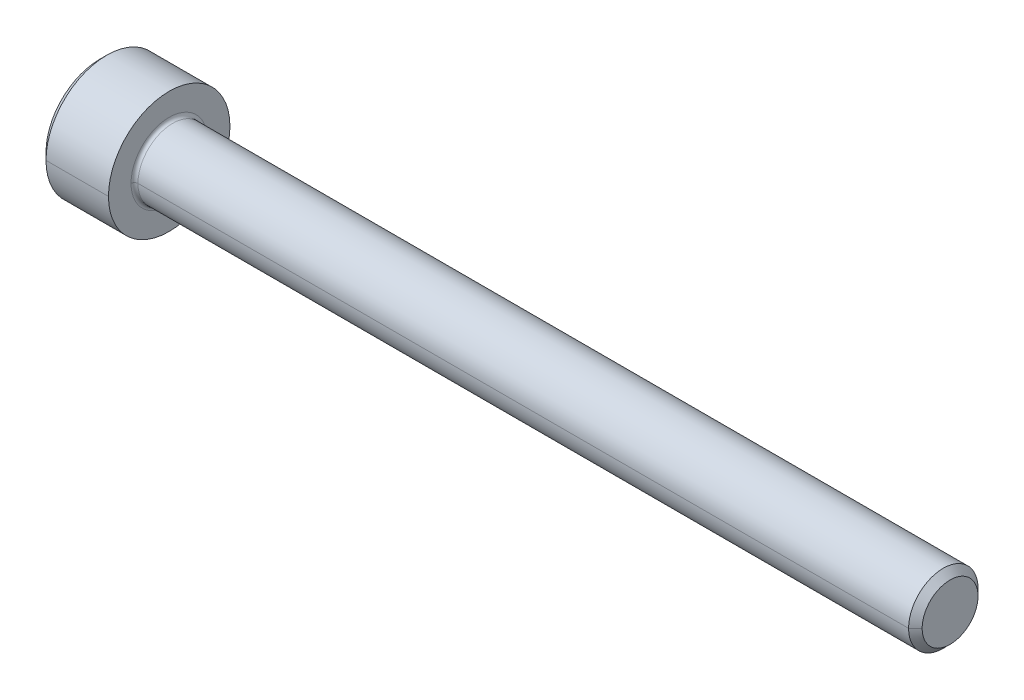
ISO-10303-21;
HEADER;
FILE_DESCRIPTION(('STEP AP214'),'2;1');
FILE_NAME('part.step','',(''),(''),'','','');
FILE_SCHEMA(('AUTOMOTIVE_DESIGN { 1 0 10303 214 1 1 1 1 }'));
ENDSEC;
DATA;
#1=APPLICATION_CONTEXT('core data for automotive mechanical design processes');
#2=APPLICATION_PROTOCOL_DEFINITION('international standard','automotive_design',2000,#1);
#3=PRODUCT_CONTEXT('',#1,'mechanical');
#4=PRODUCT('Part','Part','',(#3));
#5=PRODUCT_RELATED_PRODUCT_CATEGORY('part','',(#4));
#6=PRODUCT_DEFINITION_FORMATION('','',#4);
#7=PRODUCT_DEFINITION_CONTEXT('part definition',#1,'design');
#8=PRODUCT_DEFINITION('design','',#6,#7);
#9=PRODUCT_DEFINITION_SHAPE('','',#8);
#10=(LENGTH_UNIT() NAMED_UNIT(*) SI_UNIT(.MILLI.,.METRE.));
#11=(NAMED_UNIT(*) PLANE_ANGLE_UNIT() SI_UNIT($,.RADIAN.));
#12=(NAMED_UNIT(*) SI_UNIT($,.STERADIAN.) SOLID_ANGLE_UNIT());
#13=UNCERTAINTY_MEASURE_WITH_UNIT(LENGTH_MEASURE(1.E-05),#10,'distance_accuracy_value','');
#14=(GEOMETRIC_REPRESENTATION_CONTEXT(3) GLOBAL_UNCERTAINTY_ASSIGNED_CONTEXT((#13)) GLOBAL_UNIT_ASSIGNED_CONTEXT((#10,
#11,#12)) REPRESENTATION_CONTEXT('',''));
#15=CARTESIAN_POINT('',(0.,0.,0.));
#16=DIRECTION('',(0.,0.,1.));
#17=DIRECTION('',(1.,0.,0.));
#18=AXIS2_PLACEMENT_3D('',#15,#16,#17);
#19=CARTESIAN_POINT('',(2.,0.,0.));
#20=DIRECTION('',(-1.,0.,0.));
#21=DIRECTION('',(0.,0.,1.));
#22=AXIS2_PLACEMENT_3D('',#19,#20,#21);
#23=CONICAL_SURFACE('',#22,1.5355,1.0471975511966);
#24=DIRECTION('',(-0.500000000000008,0.,0.866025403784434));
#25=VECTOR('',#24,1.);
#26=CARTESIAN_POINT('',(2.,0.,1.5355));
#27=LINE('',#26,#25);
#28=CARTESIAN_POINT('',(2.88652133834069,0.,0.));
#29=VERTEX_POINT('',#28);
#30=CARTESIAN_POINT('',(2.,0.,1.5355));
#31=VERTEX_POINT('',#30);
#32=EDGE_CURVE('E42',#29,#31,#27,.T.);
#33=ORIENTED_EDGE('',*,*,#32,.F.);
#34=DIRECTION('',(-0.500000000000008,0.,-0.866025403784434));
#35=VECTOR('',#34,1.);
#36=CARTESIAN_POINT('',(2.,0.,-1.5355));
#37=LINE('',#36,#35);
#38=CARTESIAN_POINT('',(2.00000000000005,0.,-1.5355));
#39=VERTEX_POINT('',#38);
#40=EDGE_CURVE('E11',#29,#39,#37,.T.);
#41=ORIENTED_EDGE('',*,*,#40,.T.);
#42=CARTESIAN_POINT('',(2.,0.,0.));
#43=DIRECTION('',(-1.,0.,0.));
#44=DIRECTION('',(0.,0.,1.));
#45=AXIS2_PLACEMENT_3D('',#42,#43,#44);
#46=CIRCLE('',#45,1.5355);
#47=CARTESIAN_POINT('',(2.,-1.329782007511,-0.767749999999987));
#48=VERTEX_POINT('',#47);
#49=EDGE_CURVE('E28',#39,#48,#46,.T.);
#50=ORIENTED_EDGE('',*,*,#49,.T.);
#51=CARTESIAN_POINT('',(2.,0.,0.));
#52=DIRECTION('',(-1.,0.,0.));
#53=DIRECTION('',(0.,0.,1.));
#54=AXIS2_PLACEMENT_3D('',#51,#52,#53);
#55=CIRCLE('',#54,1.5355);
#56=CARTESIAN_POINT('',(2.,-1.32978200751099,0.76775));
#57=VERTEX_POINT('',#56);
#58=EDGE_CURVE('E172',#48,#57,#55,.T.);
#59=ORIENTED_EDGE('',*,*,#58,.T.);
#60=CARTESIAN_POINT('',(2.,0.,0.));
#61=DIRECTION('',(-1.,0.,0.));
#62=DIRECTION('',(0.,0.,1.));
#63=AXIS2_PLACEMENT_3D('',#60,#61,#62);
#64=CIRCLE('',#63,1.5355);
#65=EDGE_CURVE('E176',#57,#31,#64,.T.);
#66=ORIENTED_EDGE('',*,*,#65,.T.);
#67=EDGE_LOOP('',(#33,#41,#50,#59,#66));
#68=FACE_BOUND('',#67,.T.);
#69=ADVANCED_FACE('F17',(#68),#23,.F.);
#70=CARTESIAN_POINT('',(4.2,0.,0.));
#71=DIRECTION('',(1.,0.,0.));
#72=DIRECTION('',(0.,0.,-1.));
#73=AXIS2_PLACEMENT_3D('',#70,#71,#72);
#74=TOROIDAL_SURFACE('',#73,2.2,0.2);
#75=CARTESIAN_POINT('',(4.2,0.,0.));
#76=DIRECTION('',(1.,0.,0.));
#77=DIRECTION('',(0.,0.,-1.));
#78=AXIS2_PLACEMENT_3D('',#75,#76,#77);
#79=CIRCLE('',#78,2.);
#80=CARTESIAN_POINT('',(4.2,0.,2.));
#81=VERTEX_POINT('',#80);
#82=CARTESIAN_POINT('',(4.2,0.,-2.));
#83=VERTEX_POINT('',#82);
#84=EDGE_CURVE('E185',#81,#83,#79,.T.);
#85=ORIENTED_EDGE('',*,*,#84,.F.);
#86=CARTESIAN_POINT('',(4.2,0.,2.2));
#87=DIRECTION('',(0.,1.,0.));
#88=DIRECTION('',(0.,0.,1.));
#89=AXIS2_PLACEMENT_3D('',#86,#87,#88);
#90=CIRCLE('',#89,0.2);
#91=CARTESIAN_POINT('',(4.,0.,2.2));
#92=VERTEX_POINT('',#91);
#93=EDGE_CURVE('E193',#81,#92,#90,.T.);
#94=ORIENTED_EDGE('',*,*,#93,.T.);
#95=CARTESIAN_POINT('',(4.,0.,0.));
#96=DIRECTION('',(-1.,0.,0.));
#97=DIRECTION('',(0.,0.,-1.));
#98=AXIS2_PLACEMENT_3D('',#95,#96,#97);
#99=CIRCLE('',#98,2.2);
#100=CARTESIAN_POINT('',(4.,0.,-2.2));
#101=VERTEX_POINT('',#100);
#102=EDGE_CURVE('E182',#101,#92,#99,.T.);
#103=ORIENTED_EDGE('',*,*,#102,.F.);
#104=CARTESIAN_POINT('',(4.2,0.,-2.2));
#105=DIRECTION('',(0.,-1.,0.));
#106=DIRECTION('',(0.,0.,-1.));
#107=AXIS2_PLACEMENT_3D('',#104,#105,#106);
#108=CIRCLE('',#107,0.2);
#109=EDGE_CURVE('E188',#83,#101,#108,.T.);
#110=ORIENTED_EDGE('',*,*,#109,.F.);
#111=EDGE_LOOP('',(#85,#94,#103,#110));
#112=FACE_BOUND('',#111,.T.);
#113=ADVANCED_FACE('F396',(#112),#74,.F.);
#114=CARTESIAN_POINT('',(0.,0.,0.));
#115=DIRECTION('',(1.,0.,0.));
#116=DIRECTION('',(0.,0.,-1.));
#117=AXIS2_PLACEMENT_3D('',#114,#115,#116);
#118=CONICAL_SURFACE('',#117,3.1,0.78539816339745);
#119=CARTESIAN_POINT('',(0.,0.,0.));
#120=DIRECTION('',(-1.,0.,0.));
#121=DIRECTION('',(0.,0.,1.));
#122=AXIS2_PLACEMENT_3D('',#119,#120,#121);
#123=CIRCLE('',#122,3.1);
#124=CARTESIAN_POINT('',(0.,0.,3.1));
#125=VERTEX_POINT('',#124);
#126=CARTESIAN_POINT('',(0.,0.,-3.1));
#127=VERTEX_POINT('',#126);
#128=EDGE_CURVE('E21',#125,#127,#123,.T.);
#129=ORIENTED_EDGE('',*,*,#128,.F.);
#130=DIRECTION('',(0.707106781186549,0.,0.707106781186546));
#131=VECTOR('',#130,1.);
#132=CARTESIAN_POINT('',(0.,0.,3.1));
#133=LINE('',#132,#131);
#134=CARTESIAN_POINT('',(0.400000000000012,0.,3.5));
#135=VERTEX_POINT('',#134);
#136=EDGE_CURVE('E196',#125,#135,#133,.T.);
#137=ORIENTED_EDGE('',*,*,#136,.T.);
#138=CARTESIAN_POINT('',(0.400000000000012,0.,0.));
#139=DIRECTION('',(-1.,0.,0.));
#140=DIRECTION('',(0.,0.,1.));
#141=AXIS2_PLACEMENT_3D('',#138,#139,#140);
#142=CIRCLE('',#141,3.5);
#143=CARTESIAN_POINT('',(0.400000000000012,0.,-3.5));
#144=VERTEX_POINT('',#143);
#145=EDGE_CURVE('E205',#135,#144,#142,.T.);
#146=ORIENTED_EDGE('',*,*,#145,.T.);
#147=DIRECTION('',(0.707106781186549,0.,-0.707106781186546));
#148=VECTOR('',#147,1.);
#149=CARTESIAN_POINT('',(0.,0.,-3.1));
#150=LINE('',#149,#148);
#151=EDGE_CURVE('E251',#127,#144,#150,.T.);
#152=ORIENTED_EDGE('',*,*,#151,.F.);
#153=EDGE_LOOP('',(#129,#137,#146,#152));
#154=FACE_BOUND('',#153,.T.);
#155=ADVANCED_FACE('F435',(#154),#118,.T.);
#156=CARTESIAN_POINT('',(-31.75,0.,0.));
#157=DIRECTION('',(-1.,0.,0.));
#158=DIRECTION('',(0.,0.,1.));
#159=AXIS2_PLACEMENT_3D('',#156,#157,#158);
#160=CYLINDRICAL_SURFACE('',#159,3.5);
#161=CARTESIAN_POINT('',(4.,0.,0.));
#162=DIRECTION('',(-1.,0.,0.));
#163=DIRECTION('',(0.,0.,1.));
#164=AXIS2_PLACEMENT_3D('',#161,#162,#163);
#165=CIRCLE('',#164,3.5);
#166=CARTESIAN_POINT('',(4.,0.,3.49999999999996));
#167=VERTEX_POINT('',#166);
#168=CARTESIAN_POINT('',(4.,0.,-3.5));
#169=VERTEX_POINT('',#168);
#170=EDGE_CURVE('E210',#167,#169,#165,.T.);
#171=ORIENTED_EDGE('',*,*,#170,.T.);
#172=DIRECTION('',(-1.,0.,0.));
#173=VECTOR('',#172,1.);
#174=CARTESIAN_POINT('',(-31.75,0.,-3.5));
#175=LINE('',#174,#173);
#176=EDGE_CURVE('E206',#169,#144,#175,.T.);
#177=ORIENTED_EDGE('',*,*,#176,.T.);
#178=ORIENTED_EDGE('',*,*,#145,.F.);
#179=DIRECTION('',(-1.,0.,0.));
#180=VECTOR('',#179,1.);
#181=CARTESIAN_POINT('',(-31.75,0.,3.5));
#182=LINE('',#181,#180);
#183=EDGE_CURVE('E223',#167,#135,#182,.T.);
#184=ORIENTED_EDGE('',*,*,#183,.F.);
#185=EDGE_LOOP('',(#171,#177,#178,#184));
#186=FACE_BOUND('',#185,.T.);
#187=ADVANCED_FACE('F474',(#186),#160,.T.);
#188=CARTESIAN_POINT('',(-31.75,0.,0.));
#189=DIRECTION('',(-1.,0.,0.));
#190=DIRECTION('',(0.,0.,1.));
#191=AXIS2_PLACEMENT_3D('',#188,#189,#190);
#192=CYLINDRICAL_SURFACE('',#191,2.);
#193=CARTESIAN_POINT('',(48.61,0.,0.));
#194=DIRECTION('',(-1.,0.,0.));
#195=DIRECTION('',(0.,0.,1.));
#196=AXIS2_PLACEMENT_3D('',#193,#194,#195);
#197=CIRCLE('',#196,2.);
#198=CARTESIAN_POINT('',(48.61,0.,2.));
#199=VERTEX_POINT('',#198);
#200=CARTESIAN_POINT('',(48.61,0.,-2.));
#201=VERTEX_POINT('',#200);
#202=EDGE_CURVE('E211',#199,#201,#197,.T.);
#203=ORIENTED_EDGE('',*,*,#202,.T.);
#204=DIRECTION('',(-1.,0.,0.));
#205=VECTOR('',#204,1.);
#206=CARTESIAN_POINT('',(-31.75,0.,-2.));
#207=LINE('',#206,#205);
#208=EDGE_CURVE('E234',#201,#83,#207,.T.);
#209=ORIENTED_EDGE('',*,*,#208,.T.);
#210=CARTESIAN_POINT('',(4.2,0.,0.));
#211=DIRECTION('',(1.,0.,0.));
#212=DIRECTION('',(0.,0.,-1.));
#213=AXIS2_PLACEMENT_3D('',#210,#211,#212);
#214=CIRCLE('',#213,2.);
#215=EDGE_CURVE('E230',#83,#81,#214,.T.);
#216=ORIENTED_EDGE('',*,*,#215,.T.);
#217=DIRECTION('',(-1.,0.,0.));
#218=VECTOR('',#217,1.);
#219=CARTESIAN_POINT('',(-31.75,0.,2.));
#220=LINE('',#219,#218);
#221=EDGE_CURVE('E200',#199,#81,#220,.T.);
#222=ORIENTED_EDGE('',*,*,#221,.F.);
#223=EDGE_LOOP('',(#203,#209,#216,#222));
#224=FACE_BOUND('',#223,.T.);
#225=ADVANCED_FACE('F404',(#224),#192,.T.);
#226=CARTESIAN_POINT('',(49.,0.,0.));
#227=DIRECTION('',(-1.,0.,0.));
#228=DIRECTION('',(0.,0.,1.));
#229=AXIS2_PLACEMENT_3D('',#226,#227,#228);
#230=CONICAL_SURFACE('',#229,1.61,0.785398163397463);
#231=CARTESIAN_POINT('',(49.,0.,0.));
#232=DIRECTION('',(-1.,0.,0.));
#233=DIRECTION('',(0.,0.,1.));
#234=AXIS2_PLACEMENT_3D('',#231,#232,#233);
#235=CIRCLE('',#234,1.61);
#236=CARTESIAN_POINT('',(49.,0.,1.61));
#237=VERTEX_POINT('',#236);
#238=CARTESIAN_POINT('',(49.,0.,-1.61));
#239=VERTEX_POINT('',#238);
#240=EDGE_CURVE('E235',#237,#239,#235,.T.);
#241=ORIENTED_EDGE('',*,*,#240,.T.);
#242=DIRECTION('',(-0.70710678118654,0.,-0.707106781186555));
#243=VECTOR('',#242,1.);
#244=CARTESIAN_POINT('',(49.,0.,-1.61));
#245=LINE('',#244,#243);
#246=EDGE_CURVE('E272',#239,#201,#245,.T.);
#247=ORIENTED_EDGE('',*,*,#246,.T.);
#248=ORIENTED_EDGE('',*,*,#202,.F.);
#249=DIRECTION('',(-0.70710678118654,0.,0.707106781186555));
#250=VECTOR('',#249,1.);
#251=CARTESIAN_POINT('',(49.,0.,1.61));
#252=LINE('',#251,#250);
#253=EDGE_CURVE('E177',#237,#199,#252,.T.);
#254=ORIENTED_EDGE('',*,*,#253,.F.);
#255=EDGE_LOOP('',(#241,#247,#248,#254));
#256=FACE_BOUND('',#255,.T.);
#257=ADVANCED_FACE('F488',(#256),#230,.T.);
#258=CARTESIAN_POINT('',(0.,0.,0.));
#259=DIRECTION('',(-1.,0.,0.));
#260=DIRECTION('',(0.,1.,0.));
#261=AXIS2_PLACEMENT_3D('',#258,#259,#260);
#262=PLANE('',#261);
#263=CARTESIAN_POINT('',(0.,0.,0.));
#264=DIRECTION('',(-1.,0.,0.));
#265=DIRECTION('',(0.,0.,1.));
#266=AXIS2_PLACEMENT_3D('',#263,#264,#265);
#267=CIRCLE('',#266,3.1);
#268=EDGE_CURVE('E276',#127,#125,#267,.T.);
#269=ORIENTED_EDGE('',*,*,#268,.T.);
#270=ORIENTED_EDGE('',*,*,#128,.T.);
#271=EDGE_LOOP('',(#269,#270));
#272=FACE_BOUND('',#271,.T.);
#273=DIRECTION('',(0.,-0.5,0.866025403784439));
#274=VECTOR('',#273,1.);
#275=CARTESIAN_POINT('',(0.,1.77304267668132,0.));
#276=LINE('',#275,#274);
#277=CARTESIAN_POINT('',(0.,1.77304267668132,0.));
#278=VERTEX_POINT('',#277);
#279=CARTESIAN_POINT('',(0.,0.886521338340666,1.5355));
#280=VERTEX_POINT('',#279);
#281=EDGE_CURVE('E117',#278,#280,#276,.T.);
#282=ORIENTED_EDGE('',*,*,#281,.T.);
#283=DIRECTION('',(0.,1.,0.));
#284=VECTOR('',#283,1.);
#285=CARTESIAN_POINT('',(0.,-0.886521338340659,1.5355));
#286=LINE('',#285,#284);
#287=CARTESIAN_POINT('',(0.,-0.886521338340659,1.5355));
#288=VERTEX_POINT('',#287);
#289=EDGE_CURVE('E109',#288,#280,#286,.T.);
#290=ORIENTED_EDGE('',*,*,#289,.F.);
#291=DIRECTION('',(0.,-0.5,-0.866025403784438));
#292=VECTOR('',#291,1.);
#293=CARTESIAN_POINT('',(0.,-0.886521338340659,1.5355));
#294=LINE('',#293,#292);
#295=CARTESIAN_POINT('',(0.,-1.77304267668132,0.));
#296=VERTEX_POINT('',#295);
#297=EDGE_CURVE('E113',#288,#296,#294,.T.);
#298=ORIENTED_EDGE('',*,*,#297,.T.);
#299=DIRECTION('',(0.,0.5,-0.866025403784439));
#300=VECTOR('',#299,1.);
#301=CARTESIAN_POINT('',(0.,-1.77304267668132,0.));
#302=LINE('',#301,#300);
#303=CARTESIAN_POINT('',(0.,-0.886521338340668,-1.5355));
#304=VERTEX_POINT('',#303);
#305=EDGE_CURVE('E134',#296,#304,#302,.T.);
#306=ORIENTED_EDGE('',*,*,#305,.T.);
#307=DIRECTION('',(0.,-1.,0.));
#308=VECTOR('',#307,1.);
#309=CARTESIAN_POINT('',(0.,0.886521338340659,-1.5355));
#310=LINE('',#309,#308);
#311=CARTESIAN_POINT('',(0.,0.886521338340659,-1.5355));
#312=VERTEX_POINT('',#311);
#313=EDGE_CURVE('E228',#312,#304,#310,.T.);
#314=ORIENTED_EDGE('',*,*,#313,.F.);
#315=DIRECTION('',(0.,-0.5,-0.866025403784438));
#316=VECTOR('',#315,1.);
#317=CARTESIAN_POINT('',(0.,1.77304267668132,0.));
#318=LINE('',#317,#316);
#319=EDGE_CURVE('E229',#278,#312,#318,.T.);
#320=ORIENTED_EDGE('',*,*,#319,.F.);
#321=EDGE_LOOP('',(#282,#290,#298,#306,#314,#320));
#322=FACE_BOUND('',#321,.T.);
#323=ADVANCED_FACE('F111',(#272,#322),#262,.T.);
#324=CARTESIAN_POINT('',(49.,1.61,0.));
#325=DIRECTION('',(1.,0.,0.));
#326=DIRECTION('',(0.,0.,1.));
#327=AXIS2_PLACEMENT_3D('',#324,#325,#326);
#328=PLANE('',#327);
#329=ORIENTED_EDGE('',*,*,#240,.F.);
#330=CARTESIAN_POINT('',(49.,0.,0.));
#331=DIRECTION('',(-1.,0.,0.));
#332=DIRECTION('',(0.,0.,1.));
#333=AXIS2_PLACEMENT_3D('',#330,#331,#332);
#334=CIRCLE('',#333,1.61);
#335=EDGE_CURVE('E164',#239,#237,#334,.T.);
#336=ORIENTED_EDGE('',*,*,#335,.F.);
#337=EDGE_LOOP('',(#329,#336));
#338=FACE_BOUND('',#337,.T.);
#339=ADVANCED_FACE('F443',(#338),#328,.T.);
#340=CARTESIAN_POINT('',(49.,0.,0.));
#341=DIRECTION('',(-1.,0.,0.));
#342=DIRECTION('',(0.,0.,1.));
#343=AXIS2_PLACEMENT_3D('',#340,#341,#342);
#344=CONICAL_SURFACE('',#343,1.61,0.785398163397463);
#345=ORIENTED_EDGE('',*,*,#246,.F.);
#346=ORIENTED_EDGE('',*,*,#335,.T.);
#347=ORIENTED_EDGE('',*,*,#253,.T.);
#348=CARTESIAN_POINT('',(48.61,0.,0.));
#349=DIRECTION('',(-1.,0.,0.));
#350=DIRECTION('',(0.,0.,1.));
#351=AXIS2_PLACEMENT_3D('',#348,#349,#350);
#352=CIRCLE('',#351,2.);
#353=EDGE_CURVE('E181',#201,#199,#352,.T.);
#354=ORIENTED_EDGE('',*,*,#353,.F.);
#355=EDGE_LOOP('',(#345,#346,#347,#354));
#356=FACE_BOUND('',#355,.T.);
#357=ADVANCED_FACE('F424',(#356),#344,.T.);
#358=CARTESIAN_POINT('',(-31.75,0.,0.));
#359=DIRECTION('',(-1.,0.,0.));
#360=DIRECTION('',(0.,0.,1.));
#361=AXIS2_PLACEMENT_3D('',#358,#359,#360);
#362=CYLINDRICAL_SURFACE('',#361,2.);
#363=ORIENTED_EDGE('',*,*,#208,.F.);
#364=ORIENTED_EDGE('',*,*,#353,.T.);
#365=ORIENTED_EDGE('',*,*,#221,.T.);
#366=ORIENTED_EDGE('',*,*,#84,.T.);
#367=EDGE_LOOP('',(#363,#364,#365,#366));
#368=FACE_BOUND('',#367,.T.);
#369=ADVANCED_FACE('F402',(#368),#362,.T.);
#370=CARTESIAN_POINT('',(4.,3.5,0.));
#371=DIRECTION('',(1.,0.,0.));
#372=DIRECTION('',(0.,0.,1.));
#373=AXIS2_PLACEMENT_3D('',#370,#371,#372);
#374=PLANE('',#373);
#375=ORIENTED_EDGE('',*,*,#170,.F.);
#376=CARTESIAN_POINT('',(4.,0.,0.));
#377=DIRECTION('',(-1.,0.,0.));
#378=DIRECTION('',(0.,0.,1.));
#379=AXIS2_PLACEMENT_3D('',#376,#377,#378);
#380=CIRCLE('',#379,3.5);
#381=EDGE_CURVE('E219',#169,#167,#380,.T.);
#382=ORIENTED_EDGE('',*,*,#381,.F.);
#383=EDGE_LOOP('',(#375,#382));
#384=FACE_BOUND('',#383,.T.);
#385=ORIENTED_EDGE('',*,*,#102,.T.);
#386=CARTESIAN_POINT('',(4.,0.,0.));
#387=DIRECTION('',(-1.,0.,0.));
#388=DIRECTION('',(0.,0.,-1.));
#389=AXIS2_PLACEMENT_3D('',#386,#387,#388);
#390=CIRCLE('',#389,2.2);
#391=EDGE_CURVE('E186',#92,#101,#390,.T.);
#392=ORIENTED_EDGE('',*,*,#391,.T.);
#393=EDGE_LOOP('',(#385,#392));
#394=FACE_BOUND('',#393,.T.);
#395=ADVANCED_FACE('F410',(#384,#394),#374,.T.);
#396=CARTESIAN_POINT('',(-31.75,0.,0.));
#397=DIRECTION('',(-1.,0.,0.));
#398=DIRECTION('',(0.,0.,1.));
#399=AXIS2_PLACEMENT_3D('',#396,#397,#398);
#400=CYLINDRICAL_SURFACE('',#399,3.5);
#401=ORIENTED_EDGE('',*,*,#176,.F.);
#402=ORIENTED_EDGE('',*,*,#381,.T.);
#403=ORIENTED_EDGE('',*,*,#183,.T.);
#404=CARTESIAN_POINT('',(0.400000000000012,0.,0.));
#405=DIRECTION('',(-1.,0.,0.));
#406=DIRECTION('',(0.,0.,1.));
#407=AXIS2_PLACEMENT_3D('',#404,#405,#406);
#408=CIRCLE('',#407,3.5);
#409=EDGE_CURVE('E191',#144,#135,#408,.T.);
#410=ORIENTED_EDGE('',*,*,#409,.F.);
#411=EDGE_LOOP('',(#401,#402,#403,#410));
#412=FACE_BOUND('',#411,.T.);
#413=ADVANCED_FACE('F412',(#412),#400,.T.);
#414=CARTESIAN_POINT('',(0.,0.,0.));
#415=DIRECTION('',(1.,0.,0.));
#416=DIRECTION('',(0.,0.,-1.));
#417=AXIS2_PLACEMENT_3D('',#414,#415,#416);
#418=CONICAL_SURFACE('',#417,3.1,0.78539816339745);
#419=ORIENTED_EDGE('',*,*,#136,.F.);
#420=ORIENTED_EDGE('',*,*,#268,.F.);
#421=ORIENTED_EDGE('',*,*,#151,.T.);
#422=ORIENTED_EDGE('',*,*,#409,.T.);
#423=EDGE_LOOP('',(#419,#420,#421,#422));
#424=FACE_BOUND('',#423,.T.);
#425=ADVANCED_FACE('F421',(#424),#418,.T.);
#426=CARTESIAN_POINT('',(4.2,0.,0.));
#427=DIRECTION('',(1.,0.,0.));
#428=DIRECTION('',(0.,0.,-1.));
#429=AXIS2_PLACEMENT_3D('',#426,#427,#428);
#430=TOROIDAL_SURFACE('',#429,2.2,0.2);
#431=ORIENTED_EDGE('',*,*,#93,.F.);
#432=ORIENTED_EDGE('',*,*,#215,.F.);
#433=ORIENTED_EDGE('',*,*,#109,.T.);
#434=ORIENTED_EDGE('',*,*,#391,.F.);
#435=EDGE_LOOP('',(#431,#432,#433,#434));
#436=FACE_BOUND('',#435,.T.);
#437=ADVANCED_FACE('F408',(#436),#430,.F.);
#438=CARTESIAN_POINT('',(2.00000000000005,1.77304267668132,0.));
#439=DIRECTION('',(0.,-0.866025403784439,-0.5));
#440=DIRECTION('',(0.,0.5,-0.866025403784439));
#441=AXIS2_PLACEMENT_3D('',#438,#439,#440);
#442=PLANE('',#441);
#443=ORIENTED_EDGE('',*,*,#281,.F.);
#444=DIRECTION('',(-1.,0.,0.));
#445=VECTOR('',#444,1.);
#446=CARTESIAN_POINT('',(2.00000000000005,1.77304267668132,0.));
#447=LINE('',#446,#445);
#448=CARTESIAN_POINT('',(2.00000000000005,1.77304267668132,0.));
#449=VERTEX_POINT('',#448);
#450=EDGE_CURVE('E247',#449,#278,#447,.T.);
#451=ORIENTED_EDGE('',*,*,#450,.F.);
#452=DIRECTION('',(0.,-0.5,0.866025403784439));
#453=VECTOR('',#452,1.);
#454=CARTESIAN_POINT('',(2.00000000000005,1.77304267668132,0.));
#455=LINE('',#454,#453);
#456=CARTESIAN_POINT('',(2.,1.329782007511,0.767749999999991));
#457=VERTEX_POINT('',#456);
#458=EDGE_CURVE('E161',#449,#457,#455,.T.);
#459=ORIENTED_EDGE('',*,*,#458,.T.);
#460=DIRECTION('',(0.,-0.5,0.866025403784439));
#461=VECTOR('',#460,1.);
#462=CARTESIAN_POINT('',(2.00000000000005,1.77304267668132,0.));
#463=LINE('',#462,#461);
#464=CARTESIAN_POINT('',(2.,0.886521338340664,1.5355));
#465=VERTEX_POINT('',#464);
#466=EDGE_CURVE('E157',#457,#465,#463,.T.);
#467=ORIENTED_EDGE('',*,*,#466,.T.);
#468=DIRECTION('',(-1.,0.,0.));
#469=VECTOR('',#468,1.);
#470=CARTESIAN_POINT('',(2.,0.886521338340664,1.5355));
#471=LINE('',#470,#469);
#472=EDGE_CURVE('E122',#465,#280,#471,.T.);
#473=ORIENTED_EDGE('',*,*,#472,.T.);
#474=EDGE_LOOP('',(#443,#451,#459,#467,#473));
#475=FACE_BOUND('',#474,.T.);
#476=ADVANCED_FACE('F466',(#475),#442,.T.);
#477=CARTESIAN_POINT('',(1.99999999999996,-0.886521338340659,1.5355));
#478=DIRECTION('',(0.,0.,1.));
#479=DIRECTION('',(0.,-1.,0.));
#480=AXIS2_PLACEMENT_3D('',#477,#478,#479);
#481=PLANE('',#480);
#482=ORIENTED_EDGE('',*,*,#289,.T.);
#483=ORIENTED_EDGE('',*,*,#472,.F.);
#484=DIRECTION('',(0.,1.,0.));
#485=VECTOR('',#484,1.);
#486=CARTESIAN_POINT('',(1.99999999999996,-0.886521338340659,1.5355));
#487=LINE('',#486,#485);
#488=EDGE_CURVE('E151',#31,#465,#487,.T.);
#489=ORIENTED_EDGE('',*,*,#488,.F.);
#490=DIRECTION('',(0.,1.,0.));
#491=VECTOR('',#490,1.);
#492=CARTESIAN_POINT('',(1.99999999999996,-0.886521338340659,1.5355));
#493=LINE('',#492,#491);
#494=CARTESIAN_POINT('',(1.99999999999996,-0.886521338340659,1.5355));
#495=VERTEX_POINT('',#494);
#496=EDGE_CURVE('E140',#495,#31,#493,.T.);
#497=ORIENTED_EDGE('',*,*,#496,.F.);
#498=DIRECTION('',(-1.,0.,0.));
#499=VECTOR('',#498,1.);
#500=CARTESIAN_POINT('',(1.99999999999996,-0.886521338340659,1.5355));
#501=LINE('',#500,#499);
#502=EDGE_CURVE('E123',#495,#288,#501,.T.);
#503=ORIENTED_EDGE('',*,*,#502,.T.);
#504=EDGE_LOOP('',(#482,#483,#489,#497,#503));
#505=FACE_BOUND('',#504,.T.);
#506=ADVANCED_FACE('F137',(#505),#481,.F.);
#507=CARTESIAN_POINT('',(1.99999999999996,-0.886521338340659,1.5355));
#508=DIRECTION('',(0.,0.866025403784439,-0.5));
#509=DIRECTION('',(-1.,0.,0.));
#510=AXIS2_PLACEMENT_3D('',#507,#508,#509);
#511=PLANE('',#510);
#512=ORIENTED_EDGE('',*,*,#297,.F.);
#513=ORIENTED_EDGE('',*,*,#502,.F.);
#514=DIRECTION('',(0.,-0.5,-0.866025403784438));
#515=VECTOR('',#514,1.);
#516=CARTESIAN_POINT('',(1.99999999999996,-0.886521338340659,1.5355));
#517=LINE('',#516,#515);
#518=EDGE_CURVE('E142',#495,#57,#517,.T.);
#519=ORIENTED_EDGE('',*,*,#518,.T.);
#520=DIRECTION('',(0.,-0.5,-0.866025403784438));
#521=VECTOR('',#520,1.);
#522=CARTESIAN_POINT('',(1.99999999999996,-0.886521338340659,1.5355));
#523=LINE('',#522,#521);
#524=CARTESIAN_POINT('',(2.,-1.77304267668132,0.));
#525=VERTEX_POINT('',#524);
#526=EDGE_CURVE('E148',#57,#525,#523,.T.);
#527=ORIENTED_EDGE('',*,*,#526,.T.);
#528=DIRECTION('',(-1.,0.,0.));
#529=VECTOR('',#528,1.);
#530=CARTESIAN_POINT('',(2.,-1.77304267668132,0.));
#531=LINE('',#530,#529);
#532=EDGE_CURVE('E132',#525,#296,#531,.T.);
#533=ORIENTED_EDGE('',*,*,#532,.T.);
#534=EDGE_LOOP('',(#512,#513,#519,#527,#533));
#535=FACE_BOUND('',#534,.T.);
#536=ADVANCED_FACE('F127',(#535),#511,.T.);
#537=CARTESIAN_POINT('',(2.,-1.77304267668132,0.));
#538=DIRECTION('',(0.,0.866025403784439,0.5));
#539=DIRECTION('',(1.,0.,0.));
#540=AXIS2_PLACEMENT_3D('',#537,#538,#539);
#541=PLANE('',#540);
#542=ORIENTED_EDGE('',*,*,#305,.F.);
#543=ORIENTED_EDGE('',*,*,#532,.F.);
#544=DIRECTION('',(0.,0.5,-0.866025403784439));
#545=VECTOR('',#544,1.);
#546=CARTESIAN_POINT('',(2.,-1.77304267668132,0.));
#547=LINE('',#546,#545);
#548=EDGE_CURVE('E167',#525,#48,#547,.T.);
#549=ORIENTED_EDGE('',*,*,#548,.T.);
#550=DIRECTION('',(0.,0.5,-0.866025403784439));
#551=VECTOR('',#550,1.);
#552=CARTESIAN_POINT('',(2.,-1.77304267668132,0.));
#553=LINE('',#552,#551);
#554=CARTESIAN_POINT('',(2.00000000000005,-0.886521338340666,-1.5355));
#555=VERTEX_POINT('',#554);
#556=EDGE_CURVE('E171',#48,#555,#553,.T.);
#557=ORIENTED_EDGE('',*,*,#556,.T.);
#558=DIRECTION('',(-1.,0.,0.));
#559=VECTOR('',#558,1.);
#560=CARTESIAN_POINT('',(2.00000000000005,-0.886521338340666,-1.5355));
#561=LINE('',#560,#559);
#562=EDGE_CURVE('E257',#555,#304,#561,.T.);
#563=ORIENTED_EDGE('',*,*,#562,.T.);
#564=EDGE_LOOP('',(#542,#543,#549,#557,#563));
#565=FACE_BOUND('',#564,.T.);
#566=ADVANCED_FACE('F340',(#565),#541,.T.);
#567=CARTESIAN_POINT('',(2.00000000000005,0.886521338340661,-1.5355));
#568=DIRECTION('',(0.,0.,-1.));
#569=DIRECTION('',(0.,-1.,0.));
#570=AXIS2_PLACEMENT_3D('',#567,#568,#569);
#571=PLANE('',#570);
#572=ORIENTED_EDGE('',*,*,#313,.T.);
#573=ORIENTED_EDGE('',*,*,#562,.F.);
#574=DIRECTION('',(0.,-1.,0.));
#575=VECTOR('',#574,1.);
#576=CARTESIAN_POINT('',(2.00000000000005,0.886521338340661,-1.5355));
#577=LINE('',#576,#575);
#578=EDGE_CURVE('E256',#39,#555,#577,.T.);
#579=ORIENTED_EDGE('',*,*,#578,.F.);
#580=DIRECTION('',(0.,-1.,0.));
#581=VECTOR('',#580,1.);
#582=CARTESIAN_POINT('',(2.00000000000005,0.886521338340661,-1.5355));
#583=LINE('',#582,#581);
#584=CARTESIAN_POINT('',(2.00000000000005,0.886521338340661,-1.5355));
#585=VERTEX_POINT('',#584);
#586=EDGE_CURVE('E215',#585,#39,#583,.T.);
#587=ORIENTED_EDGE('',*,*,#586,.F.);
#588=DIRECTION('',(-1.,0.,0.));
#589=VECTOR('',#588,1.);
#590=CARTESIAN_POINT('',(2.00000000000005,0.886521338340661,-1.5355));
#591=LINE('',#590,#589);
#592=EDGE_CURVE('E224',#585,#312,#591,.T.);
#593=ORIENTED_EDGE('',*,*,#592,.T.);
#594=EDGE_LOOP('',(#572,#573,#579,#587,#593));
#595=FACE_BOUND('',#594,.T.);
#596=ADVANCED_FACE('F447',(#595),#571,.F.);
#597=CARTESIAN_POINT('',(2.00000000000005,1.77304267668132,0.));
#598=DIRECTION('',(0.,0.866025403784439,-0.5));
#599=DIRECTION('',(-1.,0.,0.));
#600=AXIS2_PLACEMENT_3D('',#597,#598,#599);
#601=PLANE('',#600);
#602=ORIENTED_EDGE('',*,*,#319,.T.);
#603=ORIENTED_EDGE('',*,*,#592,.F.);
#604=DIRECTION('',(0.,-0.5,-0.866025403784438));
#605=VECTOR('',#604,1.);
#606=CARTESIAN_POINT('',(2.00000000000005,1.77304267668132,0.));
#607=LINE('',#606,#605);
#608=CARTESIAN_POINT('',(2.00000000000005,1.32978200751099,-0.767749999999987));
#609=VERTEX_POINT('',#608);
#610=EDGE_CURVE('E252',#609,#585,#607,.T.);
#611=ORIENTED_EDGE('',*,*,#610,.F.);
#612=DIRECTION('',(0.,-0.5,-0.866025403784438));
#613=VECTOR('',#612,1.);
#614=CARTESIAN_POINT('',(2.00000000000005,1.77304267668132,0.));
#615=LINE('',#614,#613);
#616=EDGE_CURVE('E154',#449,#609,#615,.T.);
#617=ORIENTED_EDGE('',*,*,#616,.F.);
#618=ORIENTED_EDGE('',*,*,#450,.T.);
#619=EDGE_LOOP('',(#602,#603,#611,#617,#618));
#620=FACE_BOUND('',#619,.T.);
#621=ADVANCED_FACE('F460',(#620),#601,.F.);
#622=CARTESIAN_POINT('',(2.,0.886521338340664,1.5355));
#623=DIRECTION('',(-1.,0.,0.));
#624=DIRECTION('',(0.,1.,0.));
#625=AXIS2_PLACEMENT_3D('',#622,#623,#624);
#626=PLANE('',#625);
#627=ORIENTED_EDGE('',*,*,#65,.F.);
#628=ORIENTED_EDGE('',*,*,#518,.F.);
#629=ORIENTED_EDGE('',*,*,#496,.T.);
#630=EDGE_LOOP('',(#627,#628,#629));
#631=FACE_BOUND('',#630,.T.);
#632=ADVANCED_FACE('F439',(#631),#626,.T.);
#633=CARTESIAN_POINT('',(2.,0.886521338340664,1.5355));
#634=DIRECTION('',(-1.,0.,0.));
#635=DIRECTION('',(0.,1.,0.));
#636=AXIS2_PLACEMENT_3D('',#633,#634,#635);
#637=PLANE('',#636);
#638=ORIENTED_EDGE('',*,*,#58,.F.);
#639=ORIENTED_EDGE('',*,*,#548,.F.);
#640=ORIENTED_EDGE('',*,*,#526,.F.);
#641=EDGE_LOOP('',(#638,#639,#640));
#642=FACE_BOUND('',#641,.T.);
#643=ADVANCED_FACE('F19',(#642),#637,.T.);
#644=CARTESIAN_POINT('',(2.,0.886521338340664,1.5355));
#645=DIRECTION('',(-1.,0.,0.));
#646=DIRECTION('',(0.,1.,0.));
#647=AXIS2_PLACEMENT_3D('',#644,#645,#646);
#648=PLANE('',#647);
#649=ORIENTED_EDGE('',*,*,#49,.F.);
#650=ORIENTED_EDGE('',*,*,#578,.T.);
#651=ORIENTED_EDGE('',*,*,#556,.F.);
#652=EDGE_LOOP('',(#649,#650,#651));
#653=FACE_BOUND('',#652,.T.);
#654=ADVANCED_FACE('F451',(#653),#648,.T.);
#655=CARTESIAN_POINT('',(2.,0.886521338340664,1.5355));
#656=DIRECTION('',(-1.,0.,0.));
#657=DIRECTION('',(0.,1.,0.));
#658=AXIS2_PLACEMENT_3D('',#655,#656,#657);
#659=PLANE('',#658);
#660=CARTESIAN_POINT('',(2.,0.,0.));
#661=DIRECTION('',(-1.,0.,0.));
#662=DIRECTION('',(0.,0.,1.));
#663=AXIS2_PLACEMENT_3D('',#660,#661,#662);
#664=CIRCLE('',#663,1.5355);
#665=EDGE_CURVE('E282',#609,#39,#664,.T.);
#666=ORIENTED_EDGE('',*,*,#665,.F.);
#667=ORIENTED_EDGE('',*,*,#610,.T.);
#668=ORIENTED_EDGE('',*,*,#586,.T.);
#669=EDGE_LOOP('',(#666,#667,#668));
#670=FACE_BOUND('',#669,.T.);
#671=ADVANCED_FACE('F454',(#670),#659,.T.);
#672=CARTESIAN_POINT('',(2.,0.886521338340664,1.5355));
#673=DIRECTION('',(-1.,0.,0.));
#674=DIRECTION('',(0.,1.,0.));
#675=AXIS2_PLACEMENT_3D('',#672,#673,#674);
#676=PLANE('',#675);
#677=CARTESIAN_POINT('',(2.,0.,0.));
#678=DIRECTION('',(-1.,0.,0.));
#679=DIRECTION('',(0.,0.,1.));
#680=AXIS2_PLACEMENT_3D('',#677,#678,#679);
#681=CIRCLE('',#680,1.5355);
#682=EDGE_CURVE('E277',#457,#609,#681,.T.);
#683=ORIENTED_EDGE('',*,*,#682,.F.);
#684=ORIENTED_EDGE('',*,*,#458,.F.);
#685=ORIENTED_EDGE('',*,*,#616,.T.);
#686=EDGE_LOOP('',(#683,#684,#685));
#687=FACE_BOUND('',#686,.T.);
#688=ADVANCED_FACE('F458',(#687),#676,.T.);
#689=CARTESIAN_POINT('',(2.,0.886521338340664,1.5355));
#690=DIRECTION('',(-1.,0.,0.));
#691=DIRECTION('',(0.,1.,0.));
#692=AXIS2_PLACEMENT_3D('',#689,#690,#691);
#693=PLANE('',#692);
#694=CARTESIAN_POINT('',(2.,0.,0.));
#695=DIRECTION('',(-1.,0.,0.));
#696=DIRECTION('',(0.,0.,1.));
#697=AXIS2_PLACEMENT_3D('',#694,#695,#696);
#698=CIRCLE('',#697,1.5355);
#699=EDGE_CURVE('E281',#31,#457,#698,.T.);
#700=ORIENTED_EDGE('',*,*,#699,.F.);
#701=ORIENTED_EDGE('',*,*,#488,.T.);
#702=ORIENTED_EDGE('',*,*,#466,.F.);
#703=EDGE_LOOP('',(#700,#701,#702));
#704=FACE_BOUND('',#703,.T.);
#705=ADVANCED_FACE('F471',(#704),#693,.T.);
#706=CARTESIAN_POINT('',(2.,0.,0.));
#707=DIRECTION('',(-1.,0.,0.));
#708=DIRECTION('',(0.,0.,1.));
#709=AXIS2_PLACEMENT_3D('',#706,#707,#708);
#710=CONICAL_SURFACE('',#709,1.5355,1.0471975511966);
#711=ORIENTED_EDGE('',*,*,#40,.F.);
#712=ORIENTED_EDGE('',*,*,#32,.T.);
#713=ORIENTED_EDGE('',*,*,#699,.T.);
#714=ORIENTED_EDGE('',*,*,#682,.T.);
#715=ORIENTED_EDGE('',*,*,#665,.T.);
#716=EDGE_LOOP('',(#711,#712,#713,#714,#715));
#717=FACE_BOUND('',#716,.T.);
#718=ADVANCED_FACE('F496',(#717),#710,.F.);
#719=CLOSED_SHELL('',(#69,#113,#155,#187,#225,#257,#323,#339,#357,#369,#395,#413,#425,#437,#476,
#506,#536,#566,#596,#621,#632,#643,#654,#671,#688,#705,#718));
#720=MANIFOLD_SOLID_BREP('B1',#719);
#721=ADVANCED_BREP_SHAPE_REPRESENTATION('',(#18,#720),#14);
#722=SHAPE_DEFINITION_REPRESENTATION(#9,#721);
ENDSEC;
END-ISO-10303-21;
